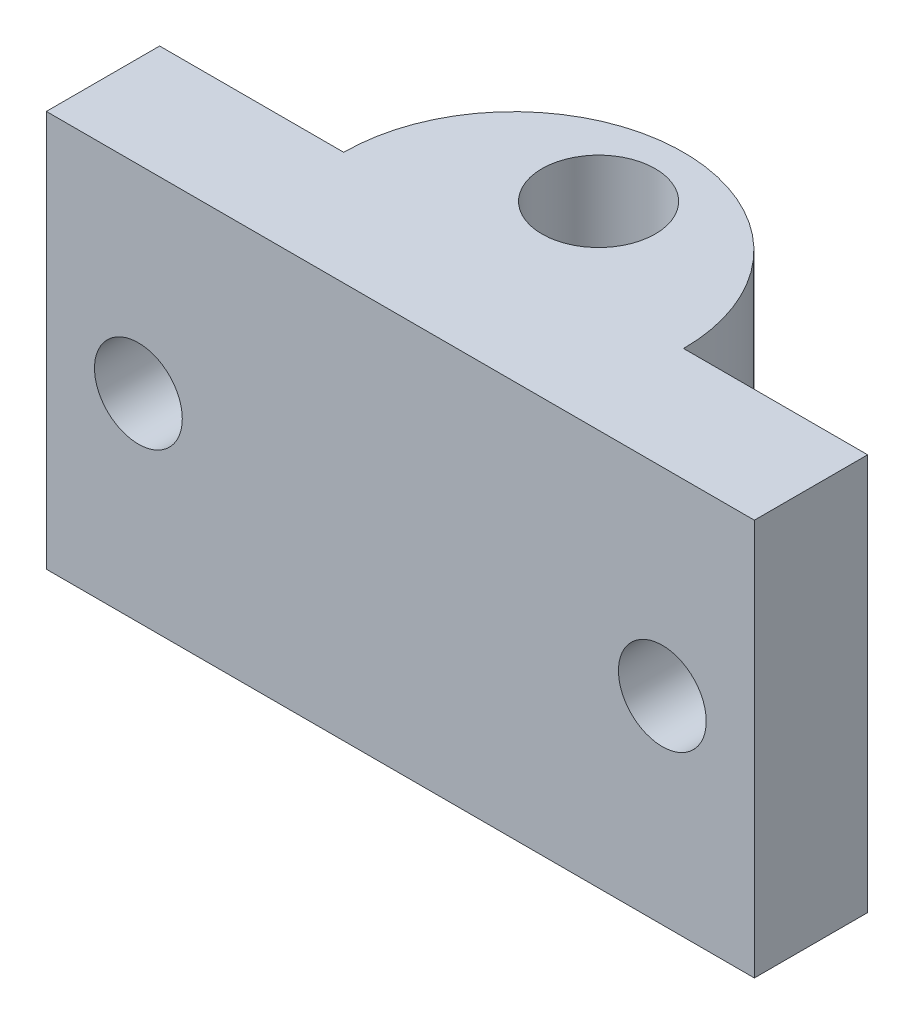
ISO-10303-21;
HEADER;
FILE_DESCRIPTION(('STEP AP214'),'2;1');
FILE_NAME('part.step','',(''),(''),'','','');
FILE_SCHEMA(('AUTOMOTIVE_DESIGN { 1 0 10303 214 1 1 1 1 }'));
ENDSEC;
DATA;
#1=APPLICATION_CONTEXT('core data for automotive mechanical design processes');
#2=APPLICATION_PROTOCOL_DEFINITION('international standard','automotive_design',2000,#1);
#3=PRODUCT_CONTEXT('',#1,'mechanical');
#4=PRODUCT('Part','Part','',(#3));
#5=PRODUCT_RELATED_PRODUCT_CATEGORY('part','',(#4));
#6=PRODUCT_DEFINITION_FORMATION('','',#4);
#7=PRODUCT_DEFINITION_CONTEXT('part definition',#1,'design');
#8=PRODUCT_DEFINITION('design','',#6,#7);
#9=PRODUCT_DEFINITION_SHAPE('','',#8);
#10=(LENGTH_UNIT() NAMED_UNIT(*) SI_UNIT(.MILLI.,.METRE.));
#11=(NAMED_UNIT(*) PLANE_ANGLE_UNIT() SI_UNIT($,.RADIAN.));
#12=(NAMED_UNIT(*) SI_UNIT($,.STERADIAN.) SOLID_ANGLE_UNIT());
#13=UNCERTAINTY_MEASURE_WITH_UNIT(LENGTH_MEASURE(1.E-05),#10,'distance_accuracy_value','');
#14=(GEOMETRIC_REPRESENTATION_CONTEXT(3) GLOBAL_UNCERTAINTY_ASSIGNED_CONTEXT((#13)) GLOBAL_UNIT_ASSIGNED_CONTEXT((#10,
#11,#12)) REPRESENTATION_CONTEXT('',''));
#15=CARTESIAN_POINT('',(0.,0.,0.));
#16=DIRECTION('',(0.,0.,1.));
#17=DIRECTION('',(1.,0.,0.));
#18=AXIS2_PLACEMENT_3D('',#15,#16,#17);
#19=CARTESIAN_POINT('',(0.,0.,0.));
#20=DIRECTION('',(0.,0.,1.));
#21=DIRECTION('',(1.,0.,0.));
#22=AXIS2_PLACEMENT_3D('',#19,#20,#21);
#23=PLANE('',#22);
#24=CARTESIAN_POINT('',(6.5,-14.,0.));
#25=DIRECTION('',(0.,0.,1.));
#26=DIRECTION('',(1.,0.,0.));
#27=AXIS2_PLACEMENT_3D('',#24,#25,#26);
#28=CIRCLE('',#27,3.1);
#29=CARTESIAN_POINT('',(9.6,-14.,0.));
#30=VERTEX_POINT('',#29);
#31=EDGE_CURVE('E154',#30,#30,#28,.T.);
#32=ORIENTED_EDGE('',*,*,#31,.T.);
#33=EDGE_LOOP('',(#32));
#34=FACE_BOUND('',#33,.T.);
#35=DIRECTION('',(1.,0.,0.));
#36=VECTOR('',#35,1.);
#37=CARTESIAN_POINT('',(0.,0.,0.));
#38=LINE('',#37,#36);
#39=CARTESIAN_POINT('',(0.,0.,0.));
#40=VERTEX_POINT('',#39);
#41=CARTESIAN_POINT('',(13.,0.,0.));
#42=VERTEX_POINT('',#41);
#43=EDGE_CURVE('E136',#40,#42,#38,.T.);
#44=ORIENTED_EDGE('',*,*,#43,.T.);
#45=DIRECTION('',(0.,-1.,0.));
#46=VECTOR('',#45,1.);
#47=CARTESIAN_POINT('',(13.,26.8328157299975,0.));
#48=LINE('',#47,#46);
#49=CARTESIAN_POINT('',(13.,-28.,0.));
#50=VERTEX_POINT('',#49);
#51=EDGE_CURVE('E102',#42,#50,#48,.T.);
#52=ORIENTED_EDGE('',*,*,#51,.T.);
#53=DIRECTION('',(-1.,0.,0.));
#54=VECTOR('',#53,1.);
#55=CARTESIAN_POINT('',(0.,-28.,0.));
#56=LINE('',#55,#54);
#57=CARTESIAN_POINT('',(0.,-28.,0.));
#58=VERTEX_POINT('',#57);
#59=EDGE_CURVE('E110',#50,#58,#56,.T.);
#60=ORIENTED_EDGE('',*,*,#59,.T.);
#61=DIRECTION('',(0.,1.,0.));
#62=VECTOR('',#61,1.);
#63=CARTESIAN_POINT('',(0.,0.,0.));
#64=LINE('',#63,#62);
#65=EDGE_CURVE('E118',#58,#40,#64,.T.);
#66=ORIENTED_EDGE('',*,*,#65,.T.);
#67=EDGE_LOOP('',(#44,#52,#60,#66));
#68=FACE_BOUND('',#67,.T.);
#69=ADVANCED_FACE('F38',(#34,#68),#23,.F.);
#70=CARTESIAN_POINT('',(0.,0.,8.));
#71=DIRECTION('',(0.,1.,0.));
#72=DIRECTION('',(0.,0.,1.));
#73=AXIS2_PLACEMENT_3D('',#70,#71,#72);
#74=PLANE('',#73);
#75=CARTESIAN_POINT('',(25.,0.,-6.));
#76=DIRECTION('',(0.,1.,0.));
#77=DIRECTION('',(0.,0.,1.));
#78=AXIS2_PLACEMENT_3D('',#75,#76,#77);
#79=CIRCLE('',#78,4.);
#80=CARTESIAN_POINT('',(25.,0.,-2.));
#81=VERTEX_POINT('',#80);
#82=EDGE_CURVE('E111',#81,#81,#79,.F.);
#83=ORIENTED_EDGE('',*,*,#82,.T.);
#84=EDGE_LOOP('',(#83));
#85=FACE_BOUND('',#84,.T.);
#86=ORIENTED_EDGE('',*,*,#43,.F.);
#87=DIRECTION('',(0.,0.,-1.));
#88=VECTOR('',#87,1.);
#89=CARTESIAN_POINT('',(0.,0.,8.));
#90=LINE('',#89,#88);
#91=CARTESIAN_POINT('',(0.,0.,8.));
#92=VERTEX_POINT('',#91);
#93=EDGE_CURVE('E11',#92,#40,#90,.T.);
#94=ORIENTED_EDGE('',*,*,#93,.F.);
#95=DIRECTION('',(1.,0.,0.));
#96=VECTOR('',#95,1.);
#97=CARTESIAN_POINT('',(0.,0.,8.));
#98=LINE('',#97,#96);
#99=CARTESIAN_POINT('',(50.,0.,8.));
#100=VERTEX_POINT('',#99);
#101=EDGE_CURVE('E116',#92,#100,#98,.T.);
#102=ORIENTED_EDGE('',*,*,#101,.T.);
#103=DIRECTION('',(0.,0.,-1.));
#104=VECTOR('',#103,1.);
#105=CARTESIAN_POINT('',(50.,0.,8.));
#106=LINE('',#105,#104);
#107=CARTESIAN_POINT('',(50.,0.,0.));
#108=VERTEX_POINT('',#107);
#109=EDGE_CURVE('E62',#100,#108,#106,.T.);
#110=ORIENTED_EDGE('',*,*,#109,.T.);
#111=CARTESIAN_POINT('',(37.,0.,0.));
#112=VERTEX_POINT('',#111);
#113=EDGE_CURVE('E83',#112,#108,#38,.T.);
#114=ORIENTED_EDGE('',*,*,#113,.F.);
#115=CARTESIAN_POINT('',(25.,0.,0.));
#116=DIRECTION('',(0.,1.,0.));
#117=DIRECTION('',(0.,0.,1.));
#118=AXIS2_PLACEMENT_3D('',#115,#116,#117);
#119=CIRCLE('',#118,12.);
#120=EDGE_CURVE('E53',#42,#112,#119,.F.);
#121=ORIENTED_EDGE('',*,*,#120,.F.);
#122=EDGE_LOOP('',(#86,#94,#102,#110,#114,#121));
#123=FACE_BOUND('',#122,.T.);
#124=ADVANCED_FACE('F40',(#85,#123),#74,.T.);
#125=CARTESIAN_POINT('',(0.,0.,8.));
#126=DIRECTION('',(-1.,0.,0.));
#127=DIRECTION('',(0.,0.,1.));
#128=AXIS2_PLACEMENT_3D('',#125,#126,#127);
#129=PLANE('',#128);
#130=ORIENTED_EDGE('',*,*,#65,.F.);
#131=DIRECTION('',(0.,0.,-1.));
#132=VECTOR('',#131,1.);
#133=CARTESIAN_POINT('',(0.,-28.,8.));
#134=LINE('',#133,#132);
#135=CARTESIAN_POINT('',(0.,-28.,8.));
#136=VERTEX_POINT('',#135);
#137=EDGE_CURVE('E46',#136,#58,#134,.T.);
#138=ORIENTED_EDGE('',*,*,#137,.F.);
#139=DIRECTION('',(0.,1.,0.));
#140=VECTOR('',#139,1.);
#141=CARTESIAN_POINT('',(0.,0.,8.));
#142=LINE('',#141,#140);
#143=EDGE_CURVE('E140',#136,#92,#142,.T.);
#144=ORIENTED_EDGE('',*,*,#143,.T.);
#145=ORIENTED_EDGE('',*,*,#93,.T.);
#146=EDGE_LOOP('',(#130,#138,#144,#145));
#147=FACE_BOUND('',#146,.T.);
#148=ADVANCED_FACE('F133',(#147),#129,.T.);
#149=CARTESIAN_POINT('',(0.,-28.,8.));
#150=DIRECTION('',(0.,-1.,0.));
#151=DIRECTION('',(0.,0.,-1.));
#152=AXIS2_PLACEMENT_3D('',#149,#150,#151);
#153=PLANE('',#152);
#154=CARTESIAN_POINT('',(25.,-28.,-6.));
#155=DIRECTION('',(0.,-1.,0.));
#156=DIRECTION('',(0.,0.,-1.));
#157=AXIS2_PLACEMENT_3D('',#154,#155,#156);
#158=CIRCLE('',#157,4.);
#159=CARTESIAN_POINT('',(25.,-28.,-10.));
#160=VERTEX_POINT('',#159);
#161=EDGE_CURVE('E147',#160,#160,#158,.T.);
#162=ORIENTED_EDGE('',*,*,#161,.F.);
#163=EDGE_LOOP('',(#162));
#164=FACE_BOUND('',#163,.T.);
#165=CARTESIAN_POINT('',(50.,-28.,0.));
#166=VERTEX_POINT('',#165);
#167=CARTESIAN_POINT('',(37.,-28.,0.));
#168=VERTEX_POINT('',#167);
#169=EDGE_CURVE('E108',#166,#168,#56,.T.);
#170=ORIENTED_EDGE('',*,*,#169,.F.);
#171=DIRECTION('',(0.,0.,-1.));
#172=VECTOR('',#171,1.);
#173=CARTESIAN_POINT('',(50.,-28.,8.));
#174=LINE('',#173,#172);
#175=CARTESIAN_POINT('',(50.,-28.,8.));
#176=VERTEX_POINT('',#175);
#177=EDGE_CURVE('E123',#176,#166,#174,.T.);
#178=ORIENTED_EDGE('',*,*,#177,.F.);
#179=DIRECTION('',(-1.,0.,0.));
#180=VECTOR('',#179,1.);
#181=CARTESIAN_POINT('',(0.,-28.,8.));
#182=LINE('',#181,#180);
#183=EDGE_CURVE('E128',#176,#136,#182,.T.);
#184=ORIENTED_EDGE('',*,*,#183,.T.);
#185=ORIENTED_EDGE('',*,*,#137,.T.);
#186=ORIENTED_EDGE('',*,*,#59,.F.);
#187=CARTESIAN_POINT('',(25.,-28.,0.));
#188=DIRECTION('',(0.,-1.,0.));
#189=DIRECTION('',(0.,0.,-1.));
#190=AXIS2_PLACEMENT_3D('',#187,#188,#189);
#191=CIRCLE('',#190,12.);
#192=EDGE_CURVE('E99',#50,#168,#191,.T.);
#193=ORIENTED_EDGE('',*,*,#192,.T.);
#194=EDGE_LOOP('',(#170,#178,#184,#185,#186,#193));
#195=FACE_BOUND('',#194,.T.);
#196=ADVANCED_FACE('F107',(#164,#195),#153,.T.);
#197=CARTESIAN_POINT('',(50.,0.,8.));
#198=DIRECTION('',(1.,0.,0.));
#199=DIRECTION('',(0.,0.,-1.));
#200=AXIS2_PLACEMENT_3D('',#197,#198,#199);
#201=PLANE('',#200);
#202=DIRECTION('',(0.,-1.,0.));
#203=VECTOR('',#202,1.);
#204=CARTESIAN_POINT('',(50.,0.,0.));
#205=LINE('',#204,#203);
#206=EDGE_CURVE('E114',#108,#166,#205,.T.);
#207=ORIENTED_EDGE('',*,*,#206,.F.);
#208=ORIENTED_EDGE('',*,*,#109,.F.);
#209=DIRECTION('',(0.,-1.,0.));
#210=VECTOR('',#209,1.);
#211=CARTESIAN_POINT('',(50.,0.,8.));
#212=LINE('',#211,#210);
#213=EDGE_CURVE('E124',#100,#176,#212,.T.);
#214=ORIENTED_EDGE('',*,*,#213,.T.);
#215=ORIENTED_EDGE('',*,*,#177,.T.);
#216=EDGE_LOOP('',(#207,#208,#214,#215));
#217=FACE_BOUND('',#216,.T.);
#218=ADVANCED_FACE('F174',(#217),#201,.T.);
#219=CARTESIAN_POINT('',(0.,0.,8.));
#220=DIRECTION('',(0.,0.,1.));
#221=DIRECTION('',(1.,0.,0.));
#222=AXIS2_PLACEMENT_3D('',#219,#220,#221);
#223=PLANE('',#222);
#224=CARTESIAN_POINT('',(6.5,-14.,8.));
#225=DIRECTION('',(0.,0.,1.));
#226=DIRECTION('',(1.,0.,0.));
#227=AXIS2_PLACEMENT_3D('',#224,#225,#226);
#228=CIRCLE('',#227,3.1);
#229=CARTESIAN_POINT('',(9.6,-14.,8.));
#230=VERTEX_POINT('',#229);
#231=EDGE_CURVE('E150',#230,#230,#228,.T.);
#232=ORIENTED_EDGE('',*,*,#231,.F.);
#233=EDGE_LOOP('',(#232));
#234=FACE_BOUND('',#233,.T.);
#235=CARTESIAN_POINT('',(43.5,-14.,8.));
#236=DIRECTION('',(0.,0.,1.));
#237=DIRECTION('',(1.,0.,0.));
#238=AXIS2_PLACEMENT_3D('',#235,#236,#237);
#239=CIRCLE('',#238,3.1);
#240=CARTESIAN_POINT('',(46.6,-14.,8.));
#241=VERTEX_POINT('',#240);
#242=EDGE_CURVE('E151',#241,#241,#239,.T.);
#243=ORIENTED_EDGE('',*,*,#242,.F.);
#244=EDGE_LOOP('',(#243));
#245=FACE_BOUND('',#244,.T.);
#246=ORIENTED_EDGE('',*,*,#101,.F.);
#247=ORIENTED_EDGE('',*,*,#143,.F.);
#248=ORIENTED_EDGE('',*,*,#183,.F.);
#249=ORIENTED_EDGE('',*,*,#213,.F.);
#250=EDGE_LOOP('',(#246,#247,#248,#249));
#251=FACE_BOUND('',#250,.T.);
#252=ADVANCED_FACE('F171',(#234,#245,#251),#223,.T.);
#253=CARTESIAN_POINT('',(43.5,-14.,0.));
#254=DIRECTION('',(0.,0.,1.));
#255=DIRECTION('',(1.,0.,0.));
#256=AXIS2_PLACEMENT_3D('',#253,#254,#255);
#257=CIRCLE('',#256,3.1);
#258=CARTESIAN_POINT('',(46.6,-14.,0.));
#259=VERTEX_POINT('',#258);
#260=EDGE_CURVE('E155',#259,#259,#257,.T.);
#261=ORIENTED_EDGE('',*,*,#260,.T.);
#262=EDGE_LOOP('',(#261));
#263=FACE_BOUND('',#262,.T.);
#264=ORIENTED_EDGE('',*,*,#169,.T.);
#265=DIRECTION('',(0.,-1.,0.));
#266=VECTOR('',#265,1.);
#267=CARTESIAN_POINT('',(37.,26.8328157299975,0.));
#268=LINE('',#267,#266);
#269=EDGE_CURVE('E96',#112,#168,#268,.T.);
#270=ORIENTED_EDGE('',*,*,#269,.F.);
#271=ORIENTED_EDGE('',*,*,#113,.T.);
#272=ORIENTED_EDGE('',*,*,#206,.T.);
#273=EDGE_LOOP('',(#264,#270,#271,#272));
#274=FACE_BOUND('',#273,.T.);
#275=ADVANCED_FACE('F113',(#263,#274),#23,.F.);
#276=CARTESIAN_POINT('',(25.,26.8328157299975,0.));
#277=DIRECTION('',(0.,-1.,0.));
#278=DIRECTION('',(0.,0.,-1.));
#279=AXIS2_PLACEMENT_3D('',#276,#277,#278);
#280=CYLINDRICAL_SURFACE('',#279,12.);
#281=ORIENTED_EDGE('',*,*,#51,.F.);
#282=ORIENTED_EDGE('',*,*,#120,.T.);
#283=ORIENTED_EDGE('',*,*,#269,.T.);
#284=ORIENTED_EDGE('',*,*,#192,.F.);
#285=EDGE_LOOP('',(#281,#282,#283,#284));
#286=FACE_BOUND('',#285,.T.);
#287=ADVANCED_FACE('F98',(#286),#280,.T.);
#288=CARTESIAN_POINT('',(25.,11.3137084989848,-6.));
#289=DIRECTION('',(0.,-1.,0.));
#290=DIRECTION('',(0.,0.,-1.));
#291=AXIS2_PLACEMENT_3D('',#288,#289,#290);
#292=CYLINDRICAL_SURFACE('',#291,4.);
#293=ORIENTED_EDGE('',*,*,#161,.T.);
#294=EDGE_LOOP('',(#293));
#295=FACE_BOUND('',#294,.T.);
#296=ORIENTED_EDGE('',*,*,#82,.F.);
#297=EDGE_LOOP('',(#296));
#298=FACE_BOUND('',#297,.T.);
#299=ADVANCED_FACE('F197',(#295,#298),#292,.F.);
#300=CARTESIAN_POINT('',(43.5,-14.,16.7681240867132));
#301=DIRECTION('',(0.,0.,-1.));
#302=DIRECTION('',(-1.,0.,0.));
#303=AXIS2_PLACEMENT_3D('',#300,#301,#302);
#304=CYLINDRICAL_SURFACE('',#303,3.1);
#305=ORIENTED_EDGE('',*,*,#260,.F.);
#306=EDGE_LOOP('',(#305));
#307=FACE_BOUND('',#306,.T.);
#308=ORIENTED_EDGE('',*,*,#242,.T.);
#309=EDGE_LOOP('',(#308));
#310=FACE_BOUND('',#309,.T.);
#311=ADVANCED_FACE('F167',(#307,#310),#304,.F.);
#312=CARTESIAN_POINT('',(6.5,-14.,16.7681240867132));
#313=DIRECTION('',(0.,0.,-1.));
#314=DIRECTION('',(-1.,0.,0.));
#315=AXIS2_PLACEMENT_3D('',#312,#313,#314);
#316=CYLINDRICAL_SURFACE('',#315,3.1);
#317=ORIENTED_EDGE('',*,*,#31,.F.);
#318=EDGE_LOOP('',(#317));
#319=FACE_BOUND('',#318,.T.);
#320=ORIENTED_EDGE('',*,*,#231,.T.);
#321=EDGE_LOOP('',(#320));
#322=FACE_BOUND('',#321,.T.);
#323=ADVANCED_FACE('F164',(#319,#322),#316,.F.);
#324=CLOSED_SHELL('',(#69,#124,#148,#196,#218,#252,#275,#287,#299,#311,#323));
#325=MANIFOLD_SOLID_BREP('B2',#324);
#326=ADVANCED_BREP_SHAPE_REPRESENTATION('',(#18,#325),#14);
#327=SHAPE_DEFINITION_REPRESENTATION(#9,#326);
ENDSEC;
END-ISO-10303-21;
